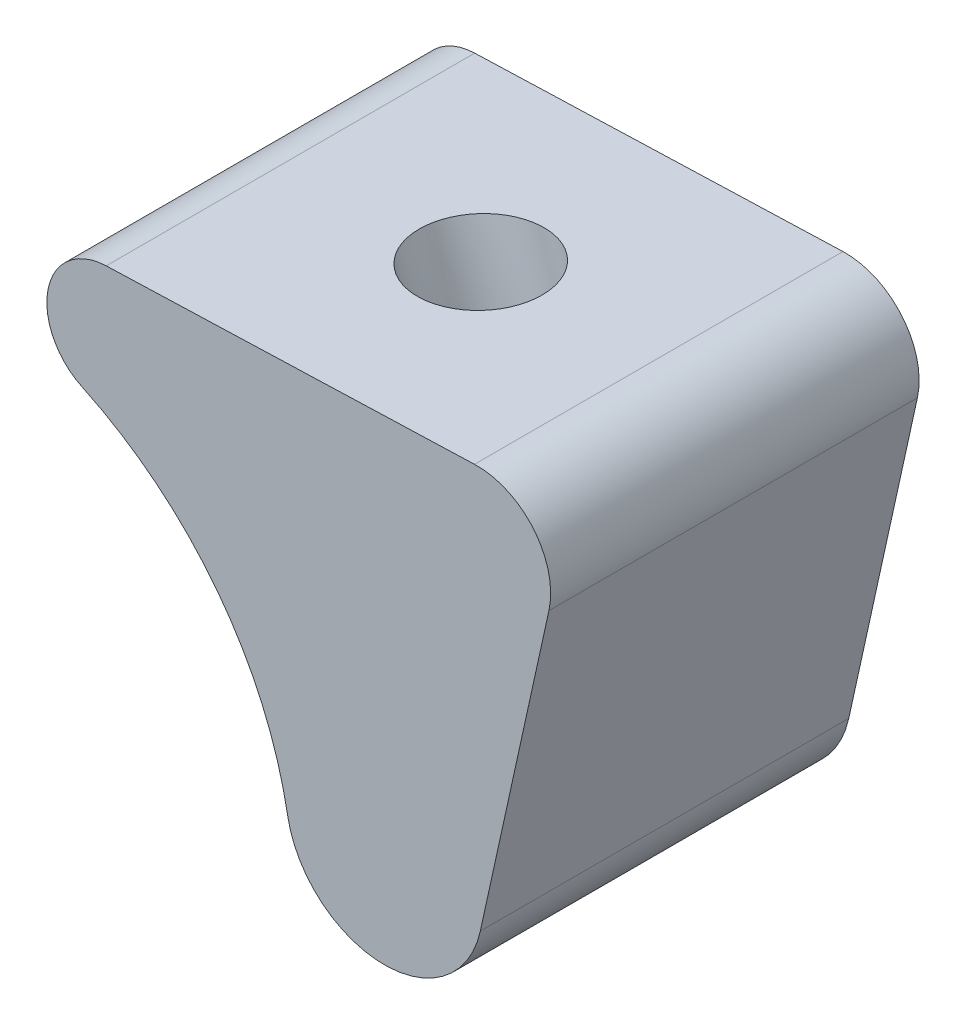
ISO-10303-21;
HEADER;
FILE_DESCRIPTION(('STEP AP214'),'2;1');
FILE_NAME('part.step','',(''),(''),'','','');
FILE_SCHEMA(('AUTOMOTIVE_DESIGN { 1 0 10303 214 1 1 1 1 }'));
ENDSEC;
DATA;
#1=APPLICATION_CONTEXT('core data for automotive mechanical design processes');
#2=APPLICATION_PROTOCOL_DEFINITION('international standard','automotive_design',2000,#1);
#3=PRODUCT_CONTEXT('',#1,'mechanical');
#4=PRODUCT('Part','Part','',(#3));
#5=PRODUCT_RELATED_PRODUCT_CATEGORY('part','',(#4));
#6=PRODUCT_DEFINITION_FORMATION('','',#4);
#7=PRODUCT_DEFINITION_CONTEXT('part definition',#1,'design');
#8=PRODUCT_DEFINITION('design','',#6,#7);
#9=PRODUCT_DEFINITION_SHAPE('','',#8);
#10=(LENGTH_UNIT() NAMED_UNIT(*) SI_UNIT(.MILLI.,.METRE.));
#11=(NAMED_UNIT(*) PLANE_ANGLE_UNIT() SI_UNIT($,.RADIAN.));
#12=(NAMED_UNIT(*) SI_UNIT($,.STERADIAN.) SOLID_ANGLE_UNIT());
#13=UNCERTAINTY_MEASURE_WITH_UNIT(LENGTH_MEASURE(1.E-05),#10,'distance_accuracy_value','');
#14=(GEOMETRIC_REPRESENTATION_CONTEXT(3) GLOBAL_UNCERTAINTY_ASSIGNED_CONTEXT((#13)) GLOBAL_UNIT_ASSIGNED_CONTEXT((#10,
#11,#12)) REPRESENTATION_CONTEXT('',''));
#15=CARTESIAN_POINT('',(0.,0.,0.));
#16=DIRECTION('',(0.,0.,1.));
#17=DIRECTION('',(1.,0.,0.));
#18=AXIS2_PLACEMENT_3D('',#15,#16,#17);
#19=CARTESIAN_POINT('',(11.2383794877435,-12.4814849054877,15.));
#20=DIRECTION('',(0.,0.,-1.));
#21=DIRECTION('',(-1.,0.,0.));
#22=AXIS2_PLACEMENT_3D('',#19,#20,#21);
#23=CYLINDRICAL_SURFACE('',#22,4.);
#24=CARTESIAN_POINT('',(11.2383794877435,-12.4814849054877,0.));
#25=DIRECTION('',(0.,0.,1.));
#26=DIRECTION('',(1.,0.,0.));
#27=AXIS2_PLACEMENT_3D('',#24,#25,#26);
#28=CIRCLE('',#27,4.);
#29=CARTESIAN_POINT('',(7.30091925099171,-13.1860463889639,0.));
#30=VERTEX_POINT('',#29);
#31=CARTESIAN_POINT('',(15.1449502007647,-13.3409645528123,0.));
#32=VERTEX_POINT('',#31);
#33=EDGE_CURVE('E121',#30,#32,#28,.T.);
#34=ORIENTED_EDGE('',*,*,#33,.T.);
#35=DIRECTION('',(0.,0.,-1.));
#36=VECTOR('',#35,1.);
#37=CARTESIAN_POINT('',(15.1449502007647,-13.3409645528123,15.));
#38=LINE('',#37,#36);
#39=CARTESIAN_POINT('',(15.1449502007647,-13.3409645528123,15.));
#40=VERTEX_POINT('',#39);
#41=EDGE_CURVE('E118',#40,#32,#38,.T.);
#42=ORIENTED_EDGE('',*,*,#41,.F.);
#43=CARTESIAN_POINT('',(11.2383794877435,-12.4814849054877,15.));
#44=DIRECTION('',(0.,0.,1.));
#45=DIRECTION('',(1.,0.,0.));
#46=AXIS2_PLACEMENT_3D('',#43,#44,#45);
#47=CIRCLE('',#46,4.);
#48=CARTESIAN_POINT('',(7.30091925099171,-13.1860463889639,15.));
#49=VERTEX_POINT('',#48);
#50=EDGE_CURVE('E105',#49,#40,#47,.T.);
#51=ORIENTED_EDGE('',*,*,#50,.F.);
#52=DIRECTION('',(0.,0.,-1.));
#53=VECTOR('',#52,1.);
#54=CARTESIAN_POINT('',(7.30091925099171,-13.1860463889639,15.));
#55=LINE('',#54,#53);
#56=EDGE_CURVE('E126',#49,#30,#55,.T.);
#57=ORIENTED_EDGE('',*,*,#56,.T.);
#58=EDGE_LOOP('',(#34,#42,#51,#57));
#59=FACE_BOUND('',#58,.T.);
#60=CARTESIAN_POINT('',(9.33089942824136,-15.9973802143104,7.50000000000095));
#61=CARTESIAN_POINT('',(9.33089993021851,-15.9973808566351,7.43427507431069));
#62=CARTESIAN_POINT('',(9.33351439937493,-15.9988028085271,7.36852290302688));
#63=CARTESIAN_POINT('',(9.34393480451392,-16.0044258940636,7.23752184969398));
#64=CARTESIAN_POINT('',(9.35174443893491,-16.0086290076057,7.17227335971527));
#65=CARTESIAN_POINT('',(9.37246686947374,-16.01963527756,7.04265365365443));
#66=CARTESIAN_POINT('',(9.38539156073305,-16.0264444932782,6.97828484685221));
#67=CARTESIAN_POINT('',(9.41616742896963,-16.0423613039821,6.85101638848552));
#68=CARTESIAN_POINT('',(9.43402083848735,-16.0514699403661,6.78811741674358));
#69=CARTESIAN_POINT('',(9.49440733484669,-16.0815667639593,6.60303741512024));
#70=CARTESIAN_POINT('',(9.54392222781461,-16.1054154998409,6.48352574580419));
#71=CARTESIAN_POINT('',(9.6598861395944,-16.1574032355627,6.25420628259825));
#72=CARTESIAN_POINT('',(9.72633417661331,-16.1855419866276,6.14439792660188));
#73=CARTESIAN_POINT('',(9.88223089700456,-16.2455955268069,5.92556475437663));
#74=CARTESIAN_POINT('',(9.97332189289181,-16.2776052294874,5.81773226324642));
#75=CARTESIAN_POINT('',(10.1728065540811,-16.3383483985899,5.61804228792862));
#76=CARTESIAN_POINT('',(10.2812095256836,-16.3670800885462,5.52619345179413));
#77=CARTESIAN_POINT('',(10.4565243848879,-16.4048013273775,5.4017788450447));
#78=CARTESIAN_POINT('',(10.5179117776115,-16.4165883526529,5.36213572928136));
#79=CARTESIAN_POINT('',(10.6442883874726,-16.43763833813,5.28831882171818));
#80=CARTESIAN_POINT('',(10.7092756393656,-16.4469026595047,5.25414208455366));
#81=CARTESIAN_POINT('',(10.8423201177941,-16.4623916491336,5.19175404273554));
#82=CARTESIAN_POINT('',(10.910373995606,-16.4686195492784,5.16353641357686));
#83=CARTESIAN_POINT('',(11.0490099105359,-16.4776029221058,5.1134789871681));
#84=CARTESIAN_POINT('',(11.1195913615487,-16.4803591945116,5.09163772195167));
#85=CARTESIAN_POINT('',(11.2522101869356,-16.4819286976474,5.0573914651906));
#86=CARTESIAN_POINT('',(11.3140085147487,-16.4812541216335,5.04407900761418));
#87=CARTESIAN_POINT('',(11.438387286053,-16.4769658005604,5.02258762080343));
#88=CARTESIAN_POINT('',(11.5009676155413,-16.4733524791108,5.01440795199714));
#89=CARTESIAN_POINT('',(11.626321324573,-16.4631241368276,5.0032901919019));
#90=CARTESIAN_POINT('',(11.6890945942473,-16.4565105906353,5.00034952908224));
#91=CARTESIAN_POINT('',(11.8142645076606,-16.4403165532753,4.99970875112554));
#92=CARTESIAN_POINT('',(11.8766611728474,-16.4307362327234,5.00200833467641));
#93=CARTESIAN_POINT('',(12.0487296327489,-16.4001311551289,5.01559423316557));
#94=CARTESIAN_POINT('',(12.1574674070532,-16.375997719419,5.03247449034519));
#95=CARTESIAN_POINT('',(12.369208216729,-16.3198785146374,5.0815519851048));
#96=CARTESIAN_POINT('',(12.4722103624873,-16.2878915315956,5.11375159141093));
#97=CARTESIAN_POINT('',(12.6752296375332,-16.2161317119533,5.19376465628634));
#98=CARTESIAN_POINT('',(12.7748796559283,-16.1760638700743,5.2422401244622));
#99=CARTESIAN_POINT('',(12.9644056110429,-16.0914197654974,5.35243911660209));
#100=CARTESIAN_POINT('',(13.0542780243464,-16.046841888677,5.4141673926223));
#101=CARTESIAN_POINT('',(13.236522410508,-15.9484321867987,5.55963891624967));
#102=CARTESIAN_POINT('',(13.3271577912033,-15.8942307091128,5.64530733119422));
#103=CARTESIAN_POINT('',(13.493894248754,-15.786411156217,5.83027707352794));
#104=CARTESIAN_POINT('',(13.5699740966206,-15.7327940390823,5.9295979556754));
#105=CARTESIAN_POINT('',(13.7164215779108,-15.6229475396354,6.15502749077914));
#106=CARTESIAN_POINT('',(13.7845391314491,-15.5673846524485,6.2829410639896));
#107=CARTESIAN_POINT('',(13.8995511904059,-15.4687803731091,6.55234593081984));
#108=CARTESIAN_POINT('',(13.946484384743,-15.4257162063804,6.69381189602779));
#109=CARTESIAN_POINT('',(14.0086386234549,-15.3671465129528,6.95152809204467));
#110=CARTESIAN_POINT('',(14.0287789637166,-15.3474986231504,7.06562653550742));
#111=CARTESIAN_POINT('',(14.0483606120683,-15.3282506948427,7.23898207694667));
#112=CARTESIAN_POINT('',(14.0531164145455,-15.3235386578437,7.29712848667825));
#113=CARTESIAN_POINT('',(14.0590432251082,-15.3176579323228,7.41379537022557));
#114=CARTESIAN_POINT('',(14.0602141566149,-15.3164893194943,7.47231585200534));
#115=CARTESIAN_POINT('',(14.0589496096915,-15.3177473848968,7.58932106441045));
#116=CARTESIAN_POINT('',(14.0565115469954,-15.3201766394268,7.64780573938818));
#117=CARTESIAN_POINT('',(14.0480607092093,-15.3285400598147,7.76427146856521));
#118=CARTESIAN_POINT('',(14.0420466001336,-15.3344755336048,7.82225232663048));
#119=CARTESIAN_POINT('',(14.0187261852344,-15.3572755366414,7.99485916601506));
#120=CARTESIAN_POINT('',(13.9961414451819,-15.3791340914384,8.10817743713502));
#121=CARTESIAN_POINT('',(13.9375385603167,-15.4337940465,8.32956073694164));
#122=CARTESIAN_POINT('',(13.9013967477589,-15.4666958836837,8.43756671867822));
#123=CARTESIAN_POINT('',(13.8166393671038,-15.540197648569,8.64575076880229));
#124=CARTESIAN_POINT('',(13.768019099058,-15.580800475303,8.74592586914001));
#125=CARTESIAN_POINT('',(13.6486924078157,-15.6747867560973,8.95551751121312));
#126=CARTESIAN_POINT('',(13.5755506926574,-15.729136890608,9.06311935318757));
#127=CARTESIAN_POINT('',(13.4133037913203,-15.839965995188,9.26444331326152));
#128=CARTESIAN_POINT('',(13.3241795659361,-15.8964474401231,9.35814863116535));
#129=CARTESIAN_POINT('',(13.1200087222192,-16.0134378681955,9.53894035040822));
#130=CARTESIAN_POINT('',(13.0032055622598,-16.0737273065075,9.6242330238594));
#131=CARTESIAN_POINT('',(12.8153006071661,-16.1581760978449,9.73460415473511));
#132=CARTESIAN_POINT('',(12.7505666807646,-16.1853220976696,9.76846028448798));
#133=CARTESIAN_POINT('',(12.6171921956882,-16.2370122690747,9.82984241201873));
#134=CARTESIAN_POINT('',(12.5485532106744,-16.2615574774672,9.85737093746842));
#135=CARTESIAN_POINT('',(12.3739396261973,-16.3184741311447,9.91716573493673));
#136=CARTESIAN_POINT('',(12.2658862822298,-16.3489315765115,9.9453423649524));
#137=CARTESIAN_POINT('',(12.0447700467081,-16.4010030160359,9.98503139528869));
#138=CARTESIAN_POINT('',(11.9317111209117,-16.4226238769352,9.99655675272003));
#139=CARTESIAN_POINT('',(11.7034548267219,-16.4560324682881,10.0021189410936));
#140=CARTESIAN_POINT('',(11.5882534557852,-16.4677993917302,9.99611888558407));
#141=CARTESIAN_POINT('',(11.3595058396795,-16.4812933023066,9.9666642272625));
#142=CARTESIAN_POINT('',(11.2459599803406,-16.4830179851793,9.94320561985773));
#143=CARTESIAN_POINT('',(11.0268771290356,-16.4773529105902,9.88079767879758));
#144=CARTESIAN_POINT('',(10.9212059911531,-16.4702113351353,9.84228992143677));
#145=CARTESIAN_POINT('',(10.7168739867882,-16.4486756163611,9.75133734295989));
#146=CARTESIAN_POINT('',(10.6182149515471,-16.4342795863925,9.69888889799862));
#147=CARTESIAN_POINT('',(10.4201599523155,-16.3983244441075,9.5758798842486));
#148=CARTESIAN_POINT('',(10.3216678715344,-16.3761950251198,9.50403622568389));
#149=CARTESIAN_POINT('',(10.1365815268093,-16.3279387234012,9.34750672945628));
#150=CARTESIAN_POINT('',(10.0499949231063,-16.3018092896096,9.2628126966102));
#151=CARTESIAN_POINT('',(9.87764752927041,-16.2441789268225,9.06853967405882));
#152=CARTESIAN_POINT('',(9.794011534298,-16.2124651089444,8.95713490310313));
#153=CARTESIAN_POINT('',(9.64556763836728,-16.1515545525973,8.72149839982641));
#154=CARTESIAN_POINT('',(9.58078023738198,-16.1223605788254,8.59725289925476));
#155=CARTESIAN_POINT('',(9.49807168068812,-16.0831950645745,8.40021986387416));
#156=CARTESIAN_POINT('',(9.47251521037033,-16.0706846805866,8.33106114887305));
#157=CARTESIAN_POINT('',(9.42748497516085,-16.0481775666429,8.19040724865996));
#158=CARTESIAN_POINT('',(9.40800792870664,-16.0381794811642,8.11891334704233));
#159=CARTESIAN_POINT('',(9.37547904312416,-16.0212501447095,7.97437474150422));
#160=CARTESIAN_POINT('',(9.36240630606933,-16.0143089264534,7.90133590389374));
#161=CARTESIAN_POINT('',(9.34283157248171,-16.0038454050625,7.75418217451204));
#162=CARTESIAN_POINT('',(9.33632336111804,-16.0003198683259,7.68006836801985));
#163=CARTESIAN_POINT('',(9.33240329375854,-15.9981956592071,7.58818810741033));
#164=CARTESIAN_POINT('',(9.33183953417509,-15.9978901046477,7.57055745303044));
#165=CARTESIAN_POINT('',(9.33108752932947,-15.9974822934346,7.53528518707724));
#166=CARTESIAN_POINT('',(9.33089929348773,-15.9973800418811,7.51764357524015));
#167=CARTESIAN_POINT('',(9.33089942824136,-15.9973802143104,7.50000000000095));
#168=B_SPLINE_CURVE_WITH_KNOTS('',3,(#60,#61,#62,#63,#64,#65,#66,#67,#68,#69,#70,#71,#72,#73,
#74,#75,#76,#77,#78,#79,#80,#81,#82,#83,#84,#85,#86,#87,#88,#89,#90,#91,#92,#93,#94,#95,#96,#97,
#98,#99,#100,#101,#102,#103,#104,#105,#106,#107,#108,#109,#110,#111,#112,#113,#114,#115,#116,
#117,#118,#119,#120,#121,#122,#123,#124,#125,#126,#127,#128,#129,#130,#131,#132,#133,#134,#135,
#136,#137,#138,#139,#140,#141,#142,#143,#144,#145,#146,#147,#148,#149,#150,#151,#152,#153,#154,
#155,#156,#157,#158,#159,#160,#161,#162,#163,#164,#165,#166,#167),.UNSPECIFIED.,.T.,.F.,(4,2,2,
2,2,2,2,2,2,2,2,2,2,2,2,2,2,2,2,2,2,2,2,2,2,2,2,2,2,2,2,2,2,2,2,2,2,2,2,2,2,2,2,2,2,2,2,2,2,2,2,
2,2,4),(0.,0.197155058002666,0.394450621118301,0.592207719775704,0.790054543014769,
1.18289073416434,1.5757041536366,2.00807237670663,2.44067381275353,2.66245784428175,
2.88412196980815,3.10554964372226,3.32692630029009,3.51631576140331,3.70567792754662,
3.89494712091489,4.08420543165412,4.42050266925843,4.75685192311208,5.10899055487537,
5.46125566441685,5.86763105527254,6.27459469317221,6.7379160416857,7.20038777006345,
7.55127161617068,7.72667357794195,7.90207928656168,8.07761065743124,8.25320754851773,
8.60431833014729,8.95871307229389,9.31324149185855,9.73456451103369,10.1563928073165,
10.6235568058831,10.8570221559271,11.0903940814571,11.436012224779,11.7813612818206,
12.1274377325385,12.4735935897588,12.8102747097099,13.147043434774,13.5173288184546,
13.88785134787,14.314676574957,14.7419643019086,14.9660437675002,15.1900020690586,
15.4132246213026,15.6362356432264,15.6891597478011,15.7420851800192),.UNSPECIFIED.);
#169=CARTESIAN_POINT('',(9.33089942824136,-15.9973802143104,7.50000000000095));
#170=VERTEX_POINT('',#169);
#171=EDGE_CURVE('E45',#170,#170,#168,.T.);
#172=ORIENTED_EDGE('',*,*,#171,.F.);
#173=EDGE_LOOP('',(#172));
#174=FACE_BOUND('',#173,.T.);
#175=ADVANCED_FACE('F41',(#59,#174),#23,.T.);
#176=CARTESIAN_POINT('',(-0.0832870755815962,2.49861226744789,15.));
#177=DIRECTION('',(-0.0333148302326385,0.999444906979154,0.));
#178=DIRECTION('',(-0.999444906979154,-0.0333148302326385,0.));
#179=AXIS2_PLACEMENT_3D('',#176,#177,#178);
#180=PLANE('',#179);
#181=CARTESIAN_POINT('',(5.16379868761101,2.67351512394142,7.5));
#182=CARTESIAN_POINT('',(5.16380491166253,2.6735153308359,7.64042610499095));
#183=CARTESIAN_POINT('',(5.17566349205324,2.67391061893738,7.7809540321403));
#184=CARTESIAN_POINT('',(5.22280516429675,2.67548200954308,8.05813965863521));
#185=CARTESIAN_POINT('',(5.25811644865037,2.67665905179413,8.1947924933314));
#186=CARTESIAN_POINT('',(5.35115829617398,2.67976044630132,8.46017212252874));
#187=CARTESIAN_POINT('',(5.40887815210244,2.68168444164908,8.5889026684679));
#188=CARTESIAN_POINT('',(5.54508398106432,2.68622463605768,8.8348047621049));
#189=CARTESIAN_POINT('',(5.62356479048005,2.68884066299799,8.95197917408377));
#190=CARTESIAN_POINT('',(5.79908059067653,2.69469118964177,9.17149637289146));
#191=CARTESIAN_POINT('',(5.89611752211995,2.69792575403399,9.27383760644603));
#192=CARTESIAN_POINT('',(6.1059900214222,2.70492150401862,9.46077108974043));
#193=CARTESIAN_POINT('',(6.21882620939702,2.70868271028156,9.54536264248493));
#194=CARTESIAN_POINT('',(6.45708885521737,2.71662479847346,9.69438926047811));
#195=CARTESIAN_POINT('',(6.58251507853968,2.72080567258498,9.7588247010965));
#196=CARTESIAN_POINT('',(6.84239881411587,2.72946846377142,9.86571190425852));
#197=CARTESIAN_POINT('',(6.97685630820968,2.733950380241,9.90816371100532));
#198=CARTESIAN_POINT('',(7.25098622358157,2.74308804408658,9.96987884513373));
#199=CARTESIAN_POINT('',(7.39065865480056,2.74774379179394,9.98914212831022));
#200=CARTESIAN_POINT('',(7.67125305198335,2.75709693836674,10.0039332190729));
#201=CARTESIAN_POINT('',(7.81217501569513,2.76179433715712,9.99946106942854));
#202=CARTESIAN_POINT('',(8.09126842660656,2.77109745085415,9.96690834048245));
#203=CARTESIAN_POINT('',(8.22943987277981,2.7757031657266,9.93882775237117));
#204=CARTESIAN_POINT('',(8.49911005995083,2.78469217196564,9.85985521676903));
#205=CARTESIAN_POINT('',(8.63060879390463,2.78907546309743,9.80896324519819));
#206=CARTESIAN_POINT('',(8.88320049200511,2.79749518636744,9.68581263152624));
#207=CARTESIAN_POINT('',(9.00429345953805,2.80153161861854,9.61355399637833));
#208=CARTESIAN_POINT('',(9.2326361519194,2.80914304169792,9.44972129370922));
#209=CARTESIAN_POINT('',(9.3398858823711,2.81271803271298,9.35814723400628));
#210=CARTESIAN_POINT('',(9.53749766848635,2.81930509225015,9.15828316813418));
#211=CARTESIAN_POINT('',(9.62785972183558,2.82231716069513,9.04999315967423));
#212=CARTESIAN_POINT('',(9.78913103333163,2.82769287107833,8.81977122488413));
#213=CARTESIAN_POINT('',(9.8600402889363,2.83005651293182,8.69783929677121));
#214=CARTESIAN_POINT('',(9.98039308117289,2.83406827267304,8.44379482906168));
#215=CARTESIAN_POINT('',(10.0298366187239,2.8357163905914,8.31168228990097));
#216=CARTESIAN_POINT('',(10.1058544208402,2.83825031732861,8.04102688833838));
#217=CARTESIAN_POINT('',(10.1324286864358,2.8391361261818,7.90248402622621));
#218=CARTESIAN_POINT('',(10.1619535832067,2.8401202894075,7.62290079757444));
#219=CARTESIAN_POINT('',(10.1649042143821,2.84021864378001,7.48186043103484));
#220=CARTESIAN_POINT('',(10.147098082148,2.83962510603887,7.2012859083385));
#221=CARTESIAN_POINT('',(10.1263413176704,2.83893321388962,7.06175175224962));
#222=CARTESIAN_POINT('',(10.0617096145486,2.83677882378556,6.78815061565822));
#223=CARTESIAN_POINT('',(10.0178346749145,2.83531632579776,6.65408363538978));
#224=CARTESIAN_POINT('',(9.90821210875598,2.83166224025914,6.39522264164999));
#225=CARTESIAN_POINT('',(9.84246448508991,2.8294706528036,6.27042862696683));
#226=CARTESIAN_POINT('',(9.69096294139137,2.82442060134698,6.03365609598123));
#227=CARTESIAN_POINT('',(9.60520902410059,2.82156213743729,5.92167757792255));
#228=CARTESIAN_POINT('',(9.41612915039609,2.81525947498048,5.713714717789));
#229=CARTESIAN_POINT('',(9.31280318686982,2.81181527619627,5.61773038218805));
#230=CARTESIAN_POINT('',(9.09151233004152,2.80443891430199,5.44448062805778));
#231=CARTESIAN_POINT('',(8.97354743197571,2.80050675103313,5.36721521561999));
#232=CARTESIAN_POINT('',(8.72632754383968,2.79226608809526,5.23359675938823));
#233=CARTESIAN_POINT('',(8.59707256568749,2.78795758882352,5.17724369351913));
#234=CARTESIAN_POINT('',(8.3309416254224,2.77908655748135,5.08704952775147));
#235=CARTESIAN_POINT('',(8.19406566615326,2.77452402550572,5.05320841945272));
#236=CARTESIAN_POINT('',(7.91657796692601,2.76527443553147,5.00899874505888));
#237=CARTESIAN_POINT('',(7.77596622023688,2.76058737730849,4.99863022125897));
#238=CARTESIAN_POINT('',(7.49499901457037,2.75122180378629,5.00166016356982));
#239=CARTESIAN_POINT('',(7.35464355510494,2.7465432884708,5.01505858437209));
#240=CARTESIAN_POINT('',(7.0781726456988,2.73732759149054,5.06524206122888));
#241=CARTESIAN_POINT('',(6.94205720428465,2.73279041010999,5.10202716431011));
#242=CARTESIAN_POINT('',(6.6779280900517,2.72398610630243,5.19794063204126));
#243=CARTESIAN_POINT('',(6.5499145681729,2.71971898890674,5.25706941281434));
#244=CARTESIAN_POINT('',(6.30563090111288,2.71157620000399,5.39598924097508));
#245=CARTESIAN_POINT('',(6.18936029509047,2.70770051313555,5.47577947708243));
#246=CARTESIAN_POINT('',(5.9718687428109,2.70045079472904,5.65374770902098));
#247=CARTESIAN_POINT('',(5.87064622318191,2.69707671074523,5.75192378006888));
#248=CARTESIAN_POINT('',(5.68608545351353,2.69092468507917,5.96391424154854));
#249=CARTESIAN_POINT('',(5.60275165480386,2.68814689177457,6.07773251276851));
#250=CARTESIAN_POINT('',(5.45633334418465,2.6832662814596,6.31779627437178));
#251=CARTESIAN_POINT('',(5.3932585195032,2.68116378735688,6.44404767231194));
#252=CARTESIAN_POINT('',(5.28926082785938,2.67769719748984,6.70525475688341));
#253=CARTESIAN_POINT('',(5.24831140703187,2.676332216597,6.84019979104085));
#254=CARTESIAN_POINT('',(5.20064086198749,2.67474319886975,7.06333736272521));
#255=CARTESIAN_POINT('',(5.18684228815232,2.67428324676163,7.1500800021656));
#256=CARTESIAN_POINT('',(5.16841925625667,2.67366914465321,7.32453517387946));
#257=CARTESIAN_POINT('',(5.1637947982003,2.67351499465304,7.41224770615335));
#258=CARTESIAN_POINT('',(5.16379868761101,2.67351512394142,7.5));
#259=B_SPLINE_CURVE_WITH_KNOTS('',3,(#181,#182,#183,#184,#185,#186,#187,#188,#189,#190,#191,
#192,#193,#194,#195,#196,#197,#198,#199,#200,#201,#202,#203,#204,#205,#206,#207,#208,#209,#210,
#211,#212,#213,#214,#215,#216,#217,#218,#219,#220,#221,#222,#223,#224,#225,#226,#227,#228,#229,
#230,#231,#232,#233,#234,#235,#236,#237,#238,#239,#240,#241,#242,#243,#244,#245,#246,#247,#248,
#249,#250,#251,#252,#253,#254,#255,#256,#257,#258),.UNSPECIFIED.,.T.,.F.,(4,2,2,2,2,2,2,2,2,2,2,
2,2,2,2,2,2,2,2,2,2,2,2,2,2,2,2,2,2,2,2,2,2,2,2,2,2,2,4),(0.,0.420958019129622,
0.842422990096231,1.26368682445264,1.68484598136543,2.10604920865554,2.5272689726805,
2.94848089181203,3.36969196399643,3.79090383914938,4.21211495531214,4.63332622865167,
5.05453794662802,5.47574952753257,5.89696093794436,6.31817240607995,6.73938392926092,
7.16059543440695,7.58180692057699,8.00301840674748,8.42422991189393,8.84544143507482,
9.26665290321048,9.68786431362271,10.109075894527,10.530287612502,10.9514988858432,
11.3727100020119,11.7939218771589,12.215132949323,12.6363448684747,13.05756463256,
13.4787678597898,13.8999270165597,14.321190851059,14.7426558223163,15.1636138412817,
15.4266705697837,15.6897272984037),.UNSPECIFIED.);
#260=CARTESIAN_POINT('',(5.16379868605896,2.67351512616924,7.5));
#261=VERTEX_POINT('',#260);
#262=EDGE_CURVE('E177',#261,#261,#259,.T.);
#263=ORIENTED_EDGE('',*,*,#262,.F.);
#264=EDGE_LOOP('',(#263));
#265=FACE_BOUND('',#264,.T.);
#266=DIRECTION('',(0.999444906979154,0.0333148302326385,0.));
#267=VECTOR('',#266,1.);
#268=CARTESIAN_POINT('',(-0.0832870755815962,2.49861226744789,0.));
#269=LINE('',#268,#267);
#270=CARTESIAN_POINT('',(-0.0832870755815963,2.49861226744789,0.));
#271=VERTEX_POINT('',#270);
#272=CARTESIAN_POINT('',(14.9083865291057,2.99833472093746,0.));
#273=VERTEX_POINT('',#272);
#274=EDGE_CURVE('E135',#271,#273,#269,.T.);
#275=ORIENTED_EDGE('',*,*,#274,.F.);
#276=DIRECTION('',(0.,0.,-1.));
#277=VECTOR('',#276,1.);
#278=CARTESIAN_POINT('',(-0.0832870755815963,2.49861226744789,15.));
#279=LINE('',#278,#277);
#280=CARTESIAN_POINT('',(-0.0832870755815963,2.49861226744789,15.));
#281=VERTEX_POINT('',#280);
#282=EDGE_CURVE('E11',#281,#271,#279,.T.);
#283=ORIENTED_EDGE('',*,*,#282,.F.);
#284=DIRECTION('',(0.999444906979154,0.0333148302326385,0.));
#285=VECTOR('',#284,1.);
#286=CARTESIAN_POINT('',(-0.0832870755815962,2.49861226744789,15.));
#287=LINE('',#286,#285);
#288=CARTESIAN_POINT('',(14.9083865291057,2.99833472093746,15.));
#289=VERTEX_POINT('',#288);
#290=EDGE_CURVE('E153',#281,#289,#287,.T.);
#291=ORIENTED_EDGE('',*,*,#290,.T.);
#292=DIRECTION('',(0.,0.,-1.));
#293=VECTOR('',#292,1.);
#294=CARTESIAN_POINT('',(14.9083865291057,2.99833472093746,15.));
#295=LINE('',#294,#293);
#296=EDGE_CURVE('E93',#289,#273,#295,.T.);
#297=ORIENTED_EDGE('',*,*,#296,.T.);
#298=EDGE_LOOP('',(#275,#283,#291,#297));
#299=FACE_BOUND('',#298,.T.);
#300=ADVANCED_FACE('F43',(#265,#299),#180,.T.);
#301=CARTESIAN_POINT('',(0.,0.,15.));
#302=DIRECTION('',(0.,0.,-1.));
#303=DIRECTION('',(-1.,0.,0.));
#304=AXIS2_PLACEMENT_3D('',#301,#302,#303);
#305=CYLINDRICAL_SURFACE('',#304,2.5);
#306=CARTESIAN_POINT('',(0.,0.,0.));
#307=DIRECTION('',(0.,0.,1.));
#308=DIRECTION('',(1.,0.,0.));
#309=AXIS2_PLACEMENT_3D('',#306,#307,#308);
#310=CIRCLE('',#309,2.5);
#311=CARTESIAN_POINT('',(-1.06636523383252,-2.26116456457139,0.));
#312=VERTEX_POINT('',#311);
#313=EDGE_CURVE('E139',#271,#312,#310,.T.);
#314=ORIENTED_EDGE('',*,*,#313,.T.);
#315=DIRECTION('',(0.,0.,-1.));
#316=VECTOR('',#315,1.);
#317=CARTESIAN_POINT('',(-1.06636523383252,-2.26116456457139,15.));
#318=LINE('',#317,#316);
#319=CARTESIAN_POINT('',(-1.06636523383252,-2.26116456457139,15.));
#320=VERTEX_POINT('',#319);
#321=EDGE_CURVE('E57',#320,#312,#318,.T.);
#322=ORIENTED_EDGE('',*,*,#321,.F.);
#323=CARTESIAN_POINT('',(0.,0.,15.));
#324=DIRECTION('',(0.,0.,1.));
#325=DIRECTION('',(1.,0.,0.));
#326=AXIS2_PLACEMENT_3D('',#323,#324,#325);
#327=CIRCLE('',#326,2.5);
#328=EDGE_CURVE('E172',#281,#320,#327,.T.);
#329=ORIENTED_EDGE('',*,*,#328,.F.);
#330=ORIENTED_EDGE('',*,*,#282,.T.);
#331=EDGE_LOOP('',(#314,#322,#329,#330));
#332=FACE_BOUND('',#331,.T.);
#333=ADVANCED_FACE('F202',(#332),#305,.T.);
#334=CARTESIAN_POINT('',(-7.46455663682766,-15.8281519519997,15.));
#335=DIRECTION('',(0.,0.,-1.));
#336=DIRECTION('',(-1.,0.,0.));
#337=AXIS2_PLACEMENT_3D('',#334,#335,#336);
#338=CYLINDRICAL_SURFACE('',#337,15.);
#339=CARTESIAN_POINT('',(-7.46455663682766,-15.8281519519997,0.));
#340=DIRECTION('',(0.,0.,1.));
#341=DIRECTION('',(1.,0.,0.));
#342=AXIS2_PLACEMENT_3D('',#339,#340,#341);
#343=CIRCLE('',#342,15.);
#344=EDGE_CURVE('E142',#312,#30,#343,.F.);
#345=ORIENTED_EDGE('',*,*,#344,.T.);
#346=ORIENTED_EDGE('',*,*,#56,.F.);
#347=CARTESIAN_POINT('',(-7.46455663682766,-15.8281519519997,15.));
#348=DIRECTION('',(0.,0.,1.));
#349=DIRECTION('',(1.,0.,0.));
#350=AXIS2_PLACEMENT_3D('',#347,#348,#349);
#351=CIRCLE('',#350,15.);
#352=EDGE_CURVE('E111',#320,#49,#351,.F.);
#353=ORIENTED_EDGE('',*,*,#352,.F.);
#354=ORIENTED_EDGE('',*,*,#321,.T.);
#355=EDGE_LOOP('',(#345,#346,#353,#354));
#356=FACE_BOUND('',#355,.T.);
#357=ADVANCED_FACE('F165',(#356),#338,.F.);
#358=CARTESIAN_POINT('',(17.2453382339032,-3.79412490188997,15.));
#359=DIRECTION('',(0.976642678255297,-0.214869911831138,0.));
#360=DIRECTION('',(0.214869911831138,0.976642678255297,0.));
#361=AXIS2_PLACEMENT_3D('',#358,#359,#360);
#362=PLANE('',#361);
#363=DIRECTION('',(-0.214869911831138,-0.976642678255297,0.));
#364=VECTOR('',#363,1.);
#365=CARTESIAN_POINT('',(17.2453382339032,-3.79412490188997,0.));
#366=LINE('',#365,#364);
#367=CARTESIAN_POINT('',(17.9382590545695,-0.644609735493412,0.));
#368=VERTEX_POINT('',#367);
#369=EDGE_CURVE('E147',#368,#32,#366,.T.);
#370=ORIENTED_EDGE('',*,*,#369,.F.);
#371=DIRECTION('',(0.,0.,-1.));
#372=VECTOR('',#371,1.);
#373=CARTESIAN_POINT('',(17.9382590545695,-0.644609735493412,15.));
#374=LINE('',#373,#372);
#375=CARTESIAN_POINT('',(17.9382590545695,-0.644609735493412,15.));
#376=VERTEX_POINT('',#375);
#377=EDGE_CURVE('E86',#376,#368,#374,.T.);
#378=ORIENTED_EDGE('',*,*,#377,.F.);
#379=DIRECTION('',(-0.214869911831138,-0.976642678255297,0.));
#380=VECTOR('',#379,1.);
#381=CARTESIAN_POINT('',(17.2453382339032,-3.79412490188997,15.));
#382=LINE('',#381,#380);
#383=EDGE_CURVE('E109',#376,#40,#382,.T.);
#384=ORIENTED_EDGE('',*,*,#383,.T.);
#385=ORIENTED_EDGE('',*,*,#41,.T.);
#386=EDGE_LOOP('',(#370,#378,#384,#385));
#387=FACE_BOUND('',#386,.T.);
#388=ADVANCED_FACE('F128',(#387),#362,.T.);
#389=CARTESIAN_POINT('',(15.0083310198036,0.,15.));
#390=DIRECTION('',(0.,0.,-1.));
#391=DIRECTION('',(-1.,0.,0.));
#392=AXIS2_PLACEMENT_3D('',#389,#390,#391);
#393=CYLINDRICAL_SURFACE('',#392,3.);
#394=CARTESIAN_POINT('',(15.0083310198036,0.,0.));
#395=DIRECTION('',(0.,0.,1.));
#396=DIRECTION('',(1.,0.,0.));
#397=AXIS2_PLACEMENT_3D('',#394,#395,#396);
#398=CIRCLE('',#397,3.);
#399=EDGE_CURVE('E150',#368,#273,#398,.T.);
#400=ORIENTED_EDGE('',*,*,#399,.T.);
#401=ORIENTED_EDGE('',*,*,#296,.F.);
#402=CARTESIAN_POINT('',(15.0083310198036,0.,15.));
#403=DIRECTION('',(0.,0.,1.));
#404=DIRECTION('',(1.,0.,0.));
#405=AXIS2_PLACEMENT_3D('',#402,#403,#404);
#406=CIRCLE('',#405,3.);
#407=EDGE_CURVE('E65',#376,#289,#406,.T.);
#408=ORIENTED_EDGE('',*,*,#407,.F.);
#409=ORIENTED_EDGE('',*,*,#377,.T.);
#410=EDGE_LOOP('',(#400,#401,#408,#409));
#411=FACE_BOUND('',#410,.T.);
#412=ADVANCED_FACE('F170',(#411),#393,.T.);
#413=CARTESIAN_POINT('',(0.,0.,15.));
#414=DIRECTION('',(0.,0.,1.));
#415=DIRECTION('',(1.,0.,0.));
#416=AXIS2_PLACEMENT_3D('',#413,#414,#415);
#417=PLANE('',#416);
#418=ORIENTED_EDGE('',*,*,#290,.F.);
#419=ORIENTED_EDGE('',*,*,#328,.T.);
#420=ORIENTED_EDGE('',*,*,#352,.T.);
#421=ORIENTED_EDGE('',*,*,#50,.T.);
#422=ORIENTED_EDGE('',*,*,#383,.F.);
#423=ORIENTED_EDGE('',*,*,#407,.T.);
#424=EDGE_LOOP('',(#418,#419,#420,#421,#422,#423));
#425=FACE_BOUND('',#424,.T.);
#426=ADVANCED_FACE('F107',(#425),#417,.T.);
#427=CARTESIAN_POINT('',(0.,0.,0.));
#428=DIRECTION('',(0.,0.,1.));
#429=DIRECTION('',(1.,0.,0.));
#430=AXIS2_PLACEMENT_3D('',#427,#428,#429);
#431=PLANE('',#430);
#432=ORIENTED_EDGE('',*,*,#274,.T.);
#433=ORIENTED_EDGE('',*,*,#399,.F.);
#434=ORIENTED_EDGE('',*,*,#369,.T.);
#435=ORIENTED_EDGE('',*,*,#33,.F.);
#436=ORIENTED_EDGE('',*,*,#344,.F.);
#437=ORIENTED_EDGE('',*,*,#313,.F.);
#438=EDGE_LOOP('',(#432,#433,#434,#435,#436,#437));
#439=FACE_BOUND('',#438,.T.);
#440=ADVANCED_FACE('F169',(#439),#431,.F.);
#441=CARTESIAN_POINT('',(4.79907180479589,3.66460171669873,7.5));
#442=CARTESIAN_POINT('',(4.92267237476197,3.33458287423419,7.5));
#443=CARTESIAN_POINT('',(5.04469278225884,3.00310231545815,7.49999999999969));
#444=CARTESIAN_POINT('',(8.02128765683756,-5.23366435238529,7.50000000000752));
#445=CARTESIAN_POINT('',(9.55097989991105,-13.7046667461882,7.49999999999994));
#446=CARTESIAN_POINT('',(9.65580532614519,-22.0883560472377,7.49999999999994));
#447=CARTESIAN_POINT('',(4.79907180479589,3.66460171669873,12.5));
#448=CARTESIAN_POINT('',(4.92267237476197,3.33458287423419,12.5));
#449=CARTESIAN_POINT('',(5.04469278225861,3.00310231545886,12.4999999999997));
#450=CARTESIAN_POINT('',(8.0212876568432,-5.23366435240222,12.5000000000075));
#451=CARTESIAN_POINT('',(9.55097989992219,-13.7046667461807,12.4999999999999));
#452=CARTESIAN_POINT('',(9.65580532614507,-22.0883560472377,12.4999999999999));
#453=CARTESIAN_POINT('',(9.79370599259654,3.89618178935812,12.5));
#454=CARTESIAN_POINT('',(9.91824449452802,3.54593397434239,12.5));
#455=CARTESIAN_POINT('',(10.0411344663375,3.19316206676052,12.4999999999999));
#456=CARTESIAN_POINT('',(13.0372936920988,-5.63053702651501,12.5000000000028));
#457=CARTESIAN_POINT('',(14.494274759384,-14.6456404927462,12.4999999999888));
#458=CARTESIAN_POINT('',(14.4309494384992,-23.5709209551759,12.5000000000001));
#459=CARTESIAN_POINT('',(9.79370599259654,3.89618178935812,7.5));
#460=CARTESIAN_POINT('',(9.91824449452802,3.54593397434239,7.5));
#461=CARTESIAN_POINT('',(10.0411344663378,3.19316206675982,7.5));
#462=CARTESIAN_POINT('',(13.0372936920912,-5.63053702649807,7.5));
#463=CARTESIAN_POINT('',(14.4942747593841,-14.6456404927462,7.4999999999888));
#464=CARTESIAN_POINT('',(14.4309494384993,-23.5709209551759,7.50000000000006));
#465=CARTESIAN_POINT('',(9.79370599259654,3.89618178935812,2.5));
#466=CARTESIAN_POINT('',(9.91824449452802,3.54593397434239,2.5));
#467=CARTESIAN_POINT('',(10.0411344663381,3.19316206675911,2.50000000000012));
#468=CARTESIAN_POINT('',(13.0372936920837,-5.63053702648114,2.49999999999718));
#469=CARTESIAN_POINT('',(14.4942747593843,-14.6456404927462,2.4999999999888));
#470=CARTESIAN_POINT('',(14.4309494384994,-23.5709209551759,2.50000000000006));
#471=CARTESIAN_POINT('',(4.79907180479589,3.66460171669873,2.5));
#472=CARTESIAN_POINT('',(4.92267237476197,3.33458287423419,2.5));
#473=CARTESIAN_POINT('',(5.04469278225908,3.00310231545745,2.49999999999969));
#474=CARTESIAN_POINT('',(8.02128765683192,-5.23366435236836,2.50000000000752));
#475=CARTESIAN_POINT('',(9.55097989989991,-13.7046667461957,2.49999999999994));
#476=CARTESIAN_POINT('',(9.65580532614531,-22.0883560472377,2.49999999999994));
#477=CARTESIAN_POINT('',(4.79907180479589,3.66460171669873,7.5));
#478=CARTESIAN_POINT('',(4.92267237476197,3.33458287423419,7.5));
#479=CARTESIAN_POINT('',(5.04469278225884,3.00310231545815,7.49999999999969));
#480=CARTESIAN_POINT('',(8.02128765683756,-5.23366435238529,7.50000000000752));
#481=CARTESIAN_POINT('',(9.55097989991105,-13.7046667461882,7.49999999999994));
#482=CARTESIAN_POINT('',(9.65580532614519,-22.0883560472377,7.49999999999994));
#483=(BOUNDED_SURFACE() B_SPLINE_SURFACE(3,3,((#441,#442,#443,#444,#445,#446),(#447,#448,#449,
#450,#451,#452),(#453,#454,#455,#456,#457,#458),(#459,#460,#461,#462,#463,#464),(#465,#466,#467,
#468,#469,#470),(#471,#472,#473,#474,#475,#476),(#477,#478,#479,#480,#481,#482)),.UNSPECIFIED.,
.T.,.F.,.F.) B_SPLINE_SURFACE_WITH_KNOTS((4,3,4),(4,2,4),(0.,0.5,1.),(0.,0.0400141466402868,1.),
.UNSPECIFIED.) GEOMETRIC_REPRESENTATION_ITEM() RATIONAL_B_SPLINE_SURFACE(((1.,1.,1.,1.,1.,1.),
(0.333333333333333,0.333333333333333,0.333333333333333,0.333333333333333,0.333333333333333,
0.333333333333333),(0.333333333333333,0.333333333333333,0.333333333333333,0.333333333333333,
0.333333333333333,0.333333333333333),(1.,1.,1.,1.,1.,1.),(0.333333333333333,0.333333333333333,
0.333333333333333,0.333333333333333,0.333333333333333,0.333333333333333),(0.333333333333333,
0.333333333333333,0.333333333333333,0.333333333333333,0.333333333333333,0.333333333333333),(1.,
1.,1.,1.,1.,1.))) REPRESENTATION_ITEM('') SURFACE());
#484=CARTESIAN_POINT('',(5.16379868605896,2.67351512616924,7.5));
#485=CARTESIAN_POINT('',(5.19764881443245,2.57984580426748,7.50000000000009));
#486=CARTESIAN_POINT('',(5.23130884753503,2.48610778915464,7.50000000000018));
#487=CARTESIAN_POINT('',(5.29825609574603,2.29847574439998,7.50000000000035));
#488=CARTESIAN_POINT('',(5.33154322820315,2.204581685268,7.50000000000043));
#489=CARTESIAN_POINT('',(5.3977443517821,2.01663971782706,7.50000000000059));
#490=CARTESIAN_POINT('',(5.43065826221743,1.92259178109717,7.50000000000067));
#491=CARTESIAN_POINT('',(5.49611261683922,1.73434422089667,7.50000000000082));
#492=CARTESIAN_POINT('',(5.52865298232586,1.64014457006202,7.5000000000009));
#493=CARTESIAN_POINT('',(5.59335992252981,1.4515957448847,7.50000000000104));
#494=CARTESIAN_POINT('',(5.62552642055581,1.35724654422298,7.50000000000111));
#495=CARTESIAN_POINT('',(5.68948530118487,1.16840078242607,7.50000000000125));
#496=CARTESIAN_POINT('',(5.72127760912636,1.07390419600441,7.50000000000132));
#497=CARTESIAN_POINT('',(5.78448778494139,0.884765825790982,7.50000000000145));
#498=CARTESIAN_POINT('',(5.81590558020382,0.790124017732681,7.50000000000151));
#499=CARTESIAN_POINT('',(5.87836640598694,0.60069736734698,7.50000000000164));
#500=CARTESIAN_POINT('',(5.90940936596724,0.505912501760008,7.50000000000169));
#501=CARTESIAN_POINT('',(5.97112019649415,0.316201899435097,7.50000000000181));
#502=CARTESIAN_POINT('',(6.00178799859087,0.22127614043128,7.50000000000186));
#503=CARTESIAN_POINT('',(6.06274818863829,0.0312859144030679,7.50000000000197));
#504=CARTESIAN_POINT('',(6.09304051024888,-0.0637785739070522,7.50000000000203));
#505=CARTESIAN_POINT('',(6.15324941459252,-0.254044095403564,7.50000000000213));
#506=CARTESIAN_POINT('',(6.1831659331141,-0.349245148909341,7.50000000000217));
#507=CARTESIAN_POINT('',(6.24262290652926,-0.539781637639049,7.50000000000227));
#508=CARTESIAN_POINT('',(6.27216329935837,-0.6351170922301,7.50000000000232));
#509=CARTESIAN_POINT('',(6.33086769661973,-0.825920219958068,7.5000000000024));
#510=CARTESIAN_POINT('',(6.36003164115244,-0.921387911524169,7.50000000000244));
#511=CARTESIAN_POINT('',(6.41798281703417,-1.11245335001555,7.50000000000252));
#512=CARTESIAN_POINT('',(6.44676999066603,-1.20805111444665,7.50000000000256));
#513=CARTESIAN_POINT('',(6.50396729994174,-1.39937453546671,7.50000000000264));
#514=CARTESIAN_POINT('',(6.53237738006782,-1.49510020865294,7.50000000000267));
#515=CARTESIAN_POINT('',(6.58882017751057,-1.68667728396703,7.50000000000274));
#516=CARTESIAN_POINT('',(6.61685284152545,-1.78252870179867,7.50000000000277));
#517=CARTESIAN_POINT('',(6.67254048190776,-1.97435510317226,7.50000000000284));
#518=CARTESIAN_POINT('',(6.70019540720554,-2.07033010153976,7.50000000000287));
#519=CARTESIAN_POINT('',(6.7551272452994,-2.26240150073841,7.50000000000292));
#520=CARTESIAN_POINT('',(6.78240410927369,-2.35849791553237,7.50000000000295));
#521=CARTESIAN_POINT('',(6.83657949985055,-2.55080998432175,7.500000000003));
#522=CARTESIAN_POINT('',(6.86347797989449,-2.64702565143292,7.50000000000302));
#523=CARTESIAN_POINT('',(6.91689627772527,-2.83957406157877,7.50000000000307));
#524=CARTESIAN_POINT('',(6.94341605123151,-2.93590681689806,7.50000000000309));
#525=CARTESIAN_POINT('',(6.99607661108661,-3.12868724016624,7.50000000000313));
#526=CARTESIAN_POINT('',(7.02221735544735,-3.22513491958468,7.50000000000314));
#527=CARTESIAN_POINT('',(7.07411953209663,-3.41814302774112,7.50000000000318));
#528=CARTESIAN_POINT('',(7.0998809247036,-3.51470346714991,7.50000000000319));
#529=CARTESIAN_POINT('',(7.15102407291641,-3.70793493196066,7.50000000000322));
#530=CARTESIAN_POINT('',(7.17640579116087,-3.80460596725111,7.50000000000323));
#531=CARTESIAN_POINT('',(7.22678926570603,-3.99805646048228,7.50000000000326));
#532=CARTESIAN_POINT('',(7.25179098697879,-4.09483592754585,7.50000000000327));
#533=CARTESIAN_POINT('',(7.3014141426246,-4.28850112096366,7.50000000000329));
#534=CARTESIAN_POINT('',(7.32603554431601,-4.38538685569193,7.50000000000329));
#535=CARTESIAN_POINT('',(7.37489773583027,-4.57926242106269,7.50000000000331));
#536=CARTESIAN_POINT('',(7.39913849533023,-4.67625225934738,7.50000000000331));
#537=CARTESIAN_POINT('',(7.44723907748021,-4.87033386843747,7.50000000000332));
#538=CARTESIAN_POINT('',(7.47109887217816,-4.96742564617041,7.50000000000332));
#539=CARTESIAN_POINT('',(7.51843719973063,-5.16170897074632,7.50000000000333));
#540=CARTESIAN_POINT('',(7.54191570701559,-5.25890052381946,7.50000000000333));
#541=CARTESIAN_POINT('',(7.5884911347368,-5.45338123564777,7.50000000000333));
#542=CARTESIAN_POINT('',(7.61158803199732,-5.55067039995319,7.50000000000333));
#543=CARTESIAN_POINT('',(7.65739991465302,-5.74534417080055,7.50000000000332));
#544=CARTESIAN_POINT('',(7.68011487927722,-5.84272878223043,7.50000000000332));
#545=CARTESIAN_POINT('',(7.72516257163267,-6.03759128386358,7.50000000000331));
#546=CARTESIAN_POINT('',(7.74749528100822,-6.13506917831024,7.50000000000331));
#547=CARTESIAN_POINT('',(7.79177813782815,-6.33011608249601,7.5000000000033));
#548=CARTESIAN_POINT('',(7.8137282693423,-6.42768509585187,7.50000000000329));
#549=CARTESIAN_POINT('',(7.85724564539097,-6.62291207435718,7.50000000000327));
#550=CARTESIAN_POINT('',(7.87881287643052,-6.72057004251474,7.50000000000326));
#551=CARTESIAN_POINT('',(7.92156412647166,-6.9159727671066,7.50000000000325));
#552=CARTESIAN_POINT('',(7.94274813442299,-7.01371752595851,7.50000000000323));
#553=CARTESIAN_POINT('',(7.98473261321984,-7.209291668404,7.50000000000321));
#554=CARTESIAN_POINT('',(8.0055330754689,-7.307121053843,7.5000000000032));
#555=CARTESIAN_POINT('',(8.04675013778422,-7.5028622859093,7.50000000000317));
#556=CARTESIAN_POINT('',(8.06716673171652,-7.60077413382822,7.50000000000316));
#557=CARTESIAN_POINT('',(8.10761573231257,-7.79667812728259,7.50000000000313));
#558=CARTESIAN_POINT('',(8.12764813531319,-7.89467027357438,7.50000000000312));
#559=CARTESIAN_POINT('',(8.16732842895172,-8.09073270018419,7.50000000000308));
#560=CARTESIAN_POINT('',(8.18697631840533,-8.18880298074188,7.50000000000307));
#561=CARTESIAN_POINT('',(8.22588725984762,-8.38501951227454,7.50000000000303));
#562=CARTESIAN_POINT('',(8.24515031313845,-8.48316576299129,7.50000000000301));
#563=CARTESIAN_POINT('',(8.28329125714527,-8.67953207121434,7.50000000000298));
#564=CARTESIAN_POINT('',(8.30216915165714,-8.77775212798337,7.50000000000295));
#565=CARTESIAN_POINT('',(8.33953945298878,-8.97426388466442,7.50000000000291));
#566=CARTESIAN_POINT('',(8.35803186610508,-9.07255558337906,7.50000000000289));
#567=CARTESIAN_POINT('',(8.39463087952133,-9.26920846028583,7.50000000000285));
#568=CARTESIAN_POINT('',(8.41273748862503,-9.3675696368395,7.50000000000283));
#569=CARTESIAN_POINT('',(8.44856456888521,-9.56435930573976,7.50000000000278));
#570=CARTESIAN_POINT('',(8.46628505135886,-9.66278779602598,7.50000000000276));
#571=CARTESIAN_POINT('',(8.50133955322178,-9.85970992868763,7.50000000000272));
#572=CARTESIAN_POINT('',(8.5186735864475,-9.9582035686,7.50000000000269));
#573=CARTESIAN_POINT('',(8.55295486467149,-10.155253836791,7.50000000000264));
#574=CARTESIAN_POINT('',(8.569902126031,-10.2538104622232,7.50000000000262));
#575=CARTESIAN_POINT('',(8.60340953537391,-10.4509845377116,7.50000000000257));
#576=CARTESIAN_POINT('',(8.61996970224849,-10.5496019845575,7.50000000000254));
#577=CARTESIAN_POINT('',(8.65270259746767,-10.7468955391114,7.50000000000249));
#578=CARTESIAN_POINT('',(8.66887534723818,-10.8455716432648,7.50000000000246));
#579=CARTESIAN_POINT('',(8.7008330830905,-11.0429803486526,7.50000000000241));
#580=CARTESIAN_POINT('',(8.7166180931374,-11.1417129460074,7.50000000000238));
#581=CARTESIAN_POINT('',(8.74780002437924,-11.3392324739973,7.50000000000233));
#582=CARTESIAN_POINT('',(8.76319697208254,-11.4380194004476,7.5000000000023));
#583=CARTESIAN_POINT('',(8.7936024534698,-11.6356454228081,7.50000000000224));
#584=CARTESIAN_POINT('',(8.8086110162091,-11.7344845142481,7.50000000000222));
#585=CARTESIAN_POINT('',(8.83823940249718,-11.9322127027477,7.50000000000216));
#586=CARTESIAN_POINT('',(8.85285925765168,-12.0311017950714,7.50000000000213));
#587=CARTESIAN_POINT('',(8.8817099035955,-12.2289278214787,7.50000000000207));
#588=CARTESIAN_POINT('',(8.89594072854394,-12.3278647505806,7.50000000000204));
#589=CARTESIAN_POINT('',(8.92401298889793,-12.5257842866644,7.50000000000198));
#590=CARTESIAN_POINT('',(8.93785446101865,-12.6247668884387,7.50000000000195));
#591=CARTESIAN_POINT('',(8.96514769053675,-12.8227756059677,7.5000000000019));
#592=CARTESIAN_POINT('',(8.97859948720766,-12.921801716309,7.50000000000186));
#593=CARTESIAN_POINT('',(9.00511304064333,-13.1198952870521,7.50000000000181));
#594=CARTESIAN_POINT('',(9.01817483924191,-13.2189627418548,7.50000000000178));
#595=CARTESIAN_POINT('',(9.04390807134807,-13.4171368375812,7.50000000000172));
#596=CARTESIAN_POINT('',(9.05657954925132,-13.5162434727399,7.50000000000169));
#597=CARTESIAN_POINT('',(9.08153181478059,-13.7144937652185,7.50000000000163));
#598=CARTESIAN_POINT('',(9.09381264936537,-13.813637416628,7.5000000000016));
#599=CARTESIAN_POINT('',(9.11798330306912,-14.011959577628,7.50000000000154));
#600=CARTESIAN_POINT('',(9.12987317171078,-14.1111380811828,7.5000000000015));
#601=CARTESIAN_POINT('',(9.15326156834277,-14.309527782474,7.50000000000145));
#602=CARTESIAN_POINT('',(9.16476014842016,-14.4087389740697,7.50000000000142));
#603=CARTESIAN_POINT('',(9.18736564272289,-14.6071918874194,7.50000000000136));
#604=CARTESIAN_POINT('',(9.19847261159978,-14.7064336029481,7.50000000000133));
#605=CARTESIAN_POINT('',(9.22029455835533,-14.9049454001336,7.50000000000127));
#606=CARTESIAN_POINT('',(9.23100959344974,-15.0042154755007,7.50000000000124));
#607=CARTESIAN_POINT('',(9.25204734729025,-15.2027818282628,7.50000000000118));
#608=CARTESIAN_POINT('',(9.26237012581566,-15.3020780993242,7.50000000000115));
#609=CARTESIAN_POINT('',(9.28262304193035,-15.50069467954,7.50000000000109));
#610=CARTESIAN_POINT('',(9.29255324186132,-15.6000149823373,7.50000000000107));
#611=CARTESIAN_POINT('',(9.31202067335846,-15.7986774613759,7.50000000000101));
#612=CARTESIAN_POINT('',(9.32155796982772,-15.8980196312571,7.50000000000098));
#613=CARTESIAN_POINT('',(9.33089942824136,-15.9973802143104,7.50000000000095));
#614=B_SPLINE_CURVE_WITH_KNOTS('',3,(#484,#485,#486,#487,#488,#489,#490,#491,#492,#493,#494,
#495,#496,#497,#498,#499,#500,#501,#502,#503,#504,#505,#506,#507,#508,#509,#510,#511,#512,#513,
#514,#515,#516,#517,#518,#519,#520,#521,#522,#523,#524,#525,#526,#527,#528,#529,#530,#531,#532,
#533,#534,#535,#536,#537,#538,#539,#540,#541,#542,#543,#544,#545,#546,#547,#548,#549,#550,#551,
#552,#553,#554,#555,#556,#557,#558,#559,#560,#561,#562,#563,#564,#565,#566,#567,#568,#569,#570,
#571,#572,#573,#574,#575,#576,#577,#578,#579,#580,#581,#582,#583,#584,#585,#586,#587,#588,#589,
#590,#591,#592,#593,#594,#595,#596,#597,#598,#599,#600,#601,#602,#603,#604,#605,#606,#607,#608,
#609,#610,#611,#612,#613),.UNSPECIFIED.,.F.,.F.,(4,2,2,2,2,2,2,2,2,2,2,2,2,2,2,2,2,2,2,2,2,2,2,
2,2,2,2,2,2,2,2,2,2,2,2,2,2,2,2,2,2,2,2,2,2,2,2,2,2,2,2,2,2,2,2,2,2,2,2,2,2,2,2,2,4),(0.,
0.298793962939906,0.597652891252542,0.896575242867651,1.19555945749682,1.49460395705656,
1.79370714609008,2.09286741218761,2.39208312640552,2.69135264368404,2.9906743032638,
3.29004642910106,3.58946733028177,3.88893530143443,4.18844862314177,4.48800556235139,
4.78760437278516,5.0872432953477,5.38692055853373,5.68663437883447,5.98638296114302,
6.28616449915884,6.58597717579133,6.88581916356249,7.18568862500875,7.48558371308208,
7.78550257155018,8.08544333539604,8.38540413121679,8.68538307762182,8.98537828563034,
9.28538785906827,9.58540989496465,9.88544248394744,10.1854837106389,10.4855316540505,
10.7855843879774,11.0856399813925,11.3856964988403,11.6857520008303,11.9858045442302,
12.2858521826589,12.5858929668792,12.8859249451905,13.1859461638214,13.4859546673218,
13.7859484989556,14.085925701093,14.3858843156028,14.6858223842453,14.9857379490644,
15.2856290527806,15.5854937391841,15.8853300535276,16.1851360429205,16.4849097567217,
16.7846492469345,17.0843525686006,17.3840177801955,17.6836429440234,17.9832261266132,
18.2827653991152,18.5822588376978,18.8817045239454,19.1811005452561),.UNSPECIFIED.);
#615=EDGE_CURVE('BSEAM185',#261,#170,#614,.T.);
#616=ORIENTED_EDGE('',*,*,#262,.T.);
#617=ORIENTED_EDGE('',*,*,#171,.T.);
#618=ORIENTED_EDGE('',*,*,#615,.T.);
#619=ORIENTED_EDGE('',*,*,#615,.F.);
#620=EDGE_LOOP('',(#616,#618,#617,#619));
#621=FACE_BOUND('',#620,.T.);
#622=ADVANCED_FACE('F185',(#621),#483,.T.);
#623=CLOSED_SHELL('',(#175,#300,#333,#357,#388,#412,#426,#440,#622));
#624=MANIFOLD_SOLID_BREP('B2',#623);
#625=ADVANCED_BREP_SHAPE_REPRESENTATION('',(#18,#624),#14);
#626=SHAPE_DEFINITION_REPRESENTATION(#9,#625);
ENDSEC;
END-ISO-10303-21;
